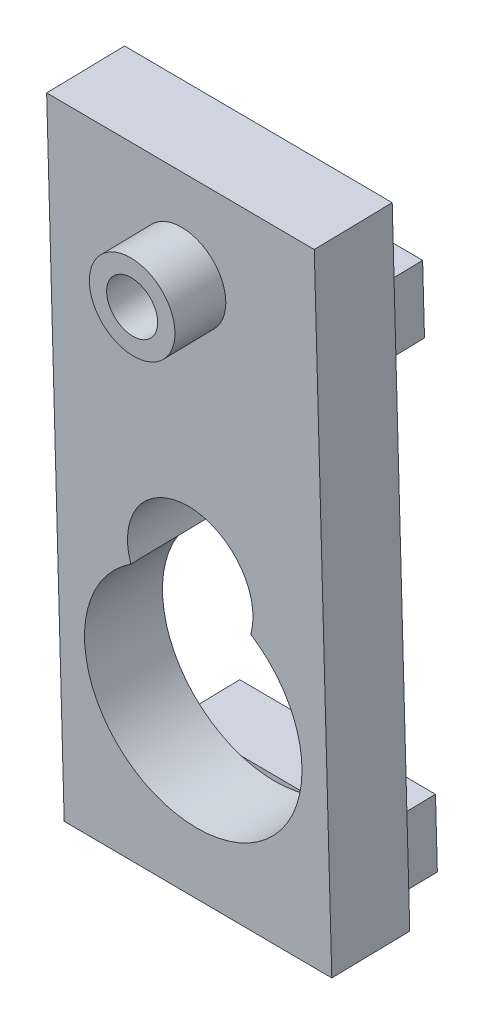
ISO-10303-21;
HEADER;
FILE_DESCRIPTION(('STEP AP214'),'2;1');
FILE_NAME('part.step','',(''),(''),'','','');
FILE_SCHEMA(('AUTOMOTIVE_DESIGN { 1 0 10303 214 1 1 1 1 }'));
ENDSEC;
DATA;
#1=APPLICATION_CONTEXT('core data for automotive mechanical design processes');
#2=APPLICATION_PROTOCOL_DEFINITION('international standard','automotive_design',2000,#1);
#3=PRODUCT_CONTEXT('',#1,'mechanical');
#4=PRODUCT('Part','Part','',(#3));
#5=PRODUCT_RELATED_PRODUCT_CATEGORY('part','',(#4));
#6=PRODUCT_DEFINITION_FORMATION('','',#4);
#7=PRODUCT_DEFINITION_CONTEXT('part definition',#1,'design');
#8=PRODUCT_DEFINITION('design','',#6,#7);
#9=PRODUCT_DEFINITION_SHAPE('','',#8);
#10=(LENGTH_UNIT() NAMED_UNIT(*) SI_UNIT(.MILLI.,.METRE.));
#11=(NAMED_UNIT(*) PLANE_ANGLE_UNIT() SI_UNIT($,.RADIAN.));
#12=(NAMED_UNIT(*) SI_UNIT($,.STERADIAN.) SOLID_ANGLE_UNIT());
#13=UNCERTAINTY_MEASURE_WITH_UNIT(LENGTH_MEASURE(1.E-05),#10,'distance_accuracy_value','');
#14=(GEOMETRIC_REPRESENTATION_CONTEXT(3) GLOBAL_UNCERTAINTY_ASSIGNED_CONTEXT((#13)) GLOBAL_UNIT_ASSIGNED_CONTEXT((#10,
#11,#12)) REPRESENTATION_CONTEXT('',''));
#15=CARTESIAN_POINT('',(0.,0.,0.));
#16=DIRECTION('',(0.,0.,1.));
#17=DIRECTION('',(1.,0.,0.));
#18=AXIS2_PLACEMENT_3D('',#15,#16,#17);
#19=CARTESIAN_POINT('',(-20.884405057928,27.3763798655828,114.124003890815));
#20=DIRECTION('',(0.999977156525081,-0.000185295208077119,0.00675663331104303));
#21=DIRECTION('',(0.00675663342703565,0.,-0.999977173691849));
#22=AXIS2_PLACEMENT_3D('',#19,#20,#21);
#23=PLANE('',#22);
#24=DIRECTION('',(0.,-0.999624168830984,-0.0274138849684033));
#25=VECTOR('',#24,1.);
#26=CARTESIAN_POINT('',(-20.8533128592784,27.5024808557868,109.525837754687));
#27=LINE('',#26,#25);
#28=CARTESIAN_POINT('',(-20.8533128592784,27.5024808557868,109.525837754687));
#29=VERTEX_POINT('',#28);
#30=CARTESIAN_POINT('',(-20.8533128592784,-10.4832375597902,108.484110125888));
#31=VERTEX_POINT('',#30);
#32=EDGE_CURVE('E243',#29,#31,#27,.T.);
#33=ORIENTED_EDGE('',*,*,#32,.T.);
#34=DIRECTION('',(0.00675917361916643,0.027413258740009,-0.999601333941306));
#35=VECTOR('',#34,1.);
#36=CARTESIAN_POINT('',(-20.8844050579265,-10.6093385499943,113.082276262018));
#37=LINE('',#36,#35);
#38=CARTESIAN_POINT('',(-20.8844050579265,-10.6093385499943,113.082276262018));
#39=VERTEX_POINT('',#38);
#40=EDGE_CURVE('E48',#39,#31,#37,.T.);
#41=ORIENTED_EDGE('',*,*,#40,.F.);
#42=DIRECTION('',(0.,-0.999624168830984,-0.0274138849684033));
#43=VECTOR('',#42,1.);
#44=CARTESIAN_POINT('',(-20.884405057928,27.3763798655828,114.124003890815));
#45=LINE('',#44,#43);
#46=CARTESIAN_POINT('',(-20.884405057928,27.3763798655828,114.124003890815));
#47=VERTEX_POINT('',#46);
#48=EDGE_CURVE('E242',#47,#39,#45,.T.);
#49=ORIENTED_EDGE('',*,*,#48,.F.);
#50=DIRECTION('',(0.00675917361916643,0.027413258740009,-0.999601333941306));
#51=VECTOR('',#50,1.);
#52=CARTESIAN_POINT('',(-20.884405057928,27.3763798655828,114.124003890815));
#53=LINE('',#52,#51);
#54=EDGE_CURVE('E251',#47,#29,#53,.T.);
#55=ORIENTED_EDGE('',*,*,#54,.T.);
#56=EDGE_LOOP('',(#33,#41,#49,#55));
#57=FACE_BOUND('',#56,.T.);
#58=ADVANCED_FACE('F41',(#57),#23,.F.);
#59=CARTESIAN_POINT('',(-20.8844050579265,-10.6093385499943,113.082276262018));
#60=DIRECTION('',(0.,0.999624168830984,0.0274138849684036));
#61=DIRECTION('',(0.,-0.0274138849684042,0.999624168830939));
#62=AXIS2_PLACEMENT_3D('',#59,#60,#61);
#63=PLANE('',#62);
#64=DIRECTION('',(0.999977156525081,-0.000185295208073576,0.00675663331104347));
#65=VECTOR('',#64,1.);
#66=CARTESIAN_POINT('',(-20.8533128592784,-10.4832375597902,108.484110125888));
#67=LINE('',#66,#65);
#68=CARTESIAN_POINT('',(-18.7033619727555,-10.4836359444876,108.498636887507));
#69=VERTEX_POINT('',#68);
#70=EDGE_CURVE('E257',#31,#69,#67,.T.);
#71=ORIENTED_EDGE('',*,*,#70,.T.);
#72=DIRECTION('',(-0.00675917361916676,-0.0274132587400088,0.999601333941306));
#73=VECTOR('',#72,1.);
#74=CARTESIAN_POINT('',(-18.5943192491483,-10.0413901072972,92.3725158386143));
#75=LINE('',#74,#73);
#76=CARTESIAN_POINT('',(-18.6780150716776,-10.3808362242126,104.750131885227));
#77=VERTEX_POINT('',#76);
#78=EDGE_CURVE('E185',#77,#69,#75,.T.);
#79=ORIENTED_EDGE('',*,*,#78,.F.);
#80=DIRECTION('',(0.999977156525081,-0.000185295208073633,0.00675663331104331));
#81=VECTOR('',#80,1.);
#82=CARTESIAN_POINT('',(-18.6780150716776,-10.3808362242126,104.750131885227));
#83=LINE('',#82,#81);
#84=CARTESIAN_POINT('',(-6.97828234033482,-10.3830041781474,104.829184494959));
#85=VERTEX_POINT('',#84);
#86=EDGE_CURVE('E175',#77,#85,#83,.T.);
#87=ORIENTED_EDGE('',*,*,#86,.T.);
#88=DIRECTION('',(-0.00675917361916676,-0.0274132587400088,0.999601333941306));
#89=VECTOR('',#88,1.);
#90=CARTESIAN_POINT('',(-6.89458651780117,-10.0435580612318,92.4515684483473));
#91=LINE('',#90,#89);
#92=CARTESIAN_POINT('',(-7.00362924140871,-10.485803898422,108.57768949724));
#93=VERTEX_POINT('',#92);
#94=EDGE_CURVE('E174',#85,#93,#91,.T.);
#95=ORIENTED_EDGE('',*,*,#94,.T.);
#96=CARTESIAN_POINT('',(-4.8536783548771,-10.4862022831194,108.592216258865));
#97=VERTEX_POINT('',#96);
#98=EDGE_CURVE('E171',#93,#97,#67,.T.);
#99=ORIENTED_EDGE('',*,*,#98,.T.);
#100=DIRECTION('',(0.00675917361916643,0.027413258740009,-0.999601333941306));
#101=VECTOR('',#100,1.);
#102=CARTESIAN_POINT('',(-4.88477055352496,-10.612303273324,113.19038239499));
#103=LINE('',#102,#101);
#104=CARTESIAN_POINT('',(-4.88477055352496,-10.612303273324,113.19038239499));
#105=VERTEX_POINT('',#104);
#106=EDGE_CURVE('E270',#105,#97,#103,.T.);
#107=ORIENTED_EDGE('',*,*,#106,.F.);
#108=DIRECTION('',(0.999977156525081,-0.000185295208073576,0.00675663331104347));
#109=VECTOR('',#108,1.);
#110=CARTESIAN_POINT('',(-20.8844050579265,-10.6093385499943,113.082276262018));
#111=LINE('',#110,#109);
#112=EDGE_CURVE('E250',#39,#105,#111,.T.);
#113=ORIENTED_EDGE('',*,*,#112,.F.);
#114=ORIENTED_EDGE('',*,*,#40,.T.);
#115=EDGE_LOOP('',(#71,#79,#87,#95,#99,#107,#113,#114));
#116=FACE_BOUND('',#115,.T.);
#117=ADVANCED_FACE('F271',(#116),#63,.F.);
#118=CARTESIAN_POINT('',(-4.88477055352496,-10.612303273324,113.19038239499));
#119=DIRECTION('',(-0.999977156525081,0.000185295208073359,-0.0067566333110433));
#120=DIRECTION('',(-0.00675663342703575,0.,0.999977173691849));
#121=AXIS2_PLACEMENT_3D('',#118,#119,#120);
#122=PLANE('',#121);
#123=DIRECTION('',(0.,0.999624168830984,0.0274138849684034));
#124=VECTOR('',#123,1.);
#125=CARTESIAN_POINT('',(-4.8536783548771,-10.4862022831194,108.592216258865));
#126=LINE('',#125,#124);
#127=CARTESIAN_POINT('',(-4.85367835487727,27.4995161324565,109.633943887664));
#128=VERTEX_POINT('',#127);
#129=EDGE_CURVE('E260',#97,#128,#126,.T.);
#130=ORIENTED_EDGE('',*,*,#129,.T.);
#131=DIRECTION('',(0.00675917361916643,0.027413258740009,-0.999601333941306));
#132=VECTOR('',#131,1.);
#133=CARTESIAN_POINT('',(-4.88477055352543,27.3734151422536,114.232110023792));
#134=LINE('',#133,#132);
#135=CARTESIAN_POINT('',(-4.88477055352543,27.3734151422536,114.232110023792));
#136=VERTEX_POINT('',#135);
#137=EDGE_CURVE('E264',#136,#128,#134,.T.);
#138=ORIENTED_EDGE('',*,*,#137,.F.);
#139=DIRECTION('',(0.,0.999624168830984,0.0274138849684034));
#140=VECTOR('',#139,1.);
#141=CARTESIAN_POINT('',(-4.88477055352496,-10.612303273324,113.19038239499));
#142=LINE('',#141,#140);
#143=EDGE_CURVE('E249',#105,#136,#142,.T.);
#144=ORIENTED_EDGE('',*,*,#143,.F.);
#145=ORIENTED_EDGE('',*,*,#106,.T.);
#146=EDGE_LOOP('',(#130,#138,#144,#145));
#147=FACE_BOUND('',#146,.T.);
#148=ADVANCED_FACE('F347',(#147),#122,.F.);
#149=CARTESIAN_POINT('',(-4.88477055352543,27.3734151422536,114.232110023792));
#150=DIRECTION('',(0.,-0.999624168830984,-0.0274138849684036));
#151=DIRECTION('',(0.,0.0274138849684035,-0.999624168830936));
#152=AXIS2_PLACEMENT_3D('',#149,#150,#151);
#153=PLANE('',#152);
#154=DIRECTION('',(-0.999977156525081,0.000185295208077046,-0.00675663331104355));
#155=VECTOR('',#154,1.);
#156=CARTESIAN_POINT('',(-4.85367835487727,27.4995161324565,109.633943887664));
#157=LINE('',#156,#155);
#158=EDGE_CURVE('E247',#128,#29,#157,.T.);
#159=ORIENTED_EDGE('',*,*,#158,.T.);
#160=ORIENTED_EDGE('',*,*,#54,.F.);
#161=DIRECTION('',(-0.999977156525081,0.000185295208077046,-0.00675663331104355));
#162=VECTOR('',#161,1.);
#163=CARTESIAN_POINT('',(-4.88477055352543,27.3734151422536,114.232110023792));
#164=LINE('',#163,#162);
#165=EDGE_CURVE('E255',#136,#47,#164,.T.);
#166=ORIENTED_EDGE('',*,*,#165,.F.);
#167=ORIENTED_EDGE('',*,*,#137,.T.);
#168=EDGE_LOOP('',(#159,#160,#166,#167));
#169=FACE_BOUND('',#168,.T.);
#170=ADVANCED_FACE('F352',(#169),#153,.F.);
#171=CARTESIAN_POINT('',(-0.766957969553894,-3.11056032093504,113.4239557435));
#172=DIRECTION('',(-0.00675917361916677,-0.0274132587400088,0.999601333941306));
#173=DIRECTION('',(0.,-0.999624168830984,-0.0274138849684033));
#174=AXIS2_PLACEMENT_3D('',#171,#172,#173);
#175=PLANE('',#174);
#176=CARTESIAN_POINT('',(-12.8845878057327,21.8869608170352,114.02755472882));
#177=DIRECTION('',(-0.00675917361916677,-0.0274132587400088,0.999601333941306));
#178=DIRECTION('',(0.,-0.999624168830984,-0.0274138849684032));
#179=AXIS2_PLACEMENT_3D('',#176,#177,#178);
#180=CIRCLE('',#179,2.56);
#181=CARTESIAN_POINT('',(-12.8845878057329,24.4459986892435,114.097734274339));
#182=VERTEX_POINT('',#181);
#183=EDGE_CURVE('E297',#182,#182,#180,.T.);
#184=ORIENTED_EDGE('',*,*,#183,.F.);
#185=EDGE_LOOP('',(#184));
#186=FACE_BOUND('',#185,.T.);
#187=CARTESIAN_POINT('',(-12.8845878057286,-0.364673181141409,113.417321649423));
#188=DIRECTION('',(-0.00675917361916677,-0.0274132587400088,0.999601333941306));
#189=DIRECTION('',(0.,-0.999624168830984,-0.0274138849684033));
#190=AXIS2_PLACEMENT_3D('',#187,#188,#189);
#191=CIRCLE('',#190,6.50000000000001);
#192=CARTESIAN_POINT('',(-9.29913527495973,5.05424292160044,113.590175405726));
#193=VERTEX_POINT('',#192);
#194=CARTESIAN_POINT('',(-16.4700403364921,5.05557168629963,113.541723122904));
#195=VERTEX_POINT('',#194);
#196=EDGE_CURVE('E222',#193,#195,#191,.F.);
#197=ORIENTED_EDGE('',*,*,#196,.T.);
#198=CARTESIAN_POINT('',(-12.884587805726,6.15287639963634,113.596060179426));
#199=DIRECTION('',(-0.00675917361916677,-0.0274132587400088,0.999601333941306));
#200=DIRECTION('',(0.,-0.999624168830984,-0.0274138849684033));
#201=AXIS2_PLACEMENT_3D('',#198,#199,#200);
#202=CIRCLE('',#201,3.74999999999999);
#203=EDGE_CURVE('E238',#195,#193,#202,.F.);
#204=ORIENTED_EDGE('',*,*,#203,.T.);
#205=EDGE_LOOP('',(#197,#204));
#206=FACE_BOUND('',#205,.T.);
#207=ORIENTED_EDGE('',*,*,#48,.T.);
#208=ORIENTED_EDGE('',*,*,#112,.T.);
#209=ORIENTED_EDGE('',*,*,#143,.T.);
#210=ORIENTED_EDGE('',*,*,#165,.T.);
#211=EDGE_LOOP('',(#207,#208,#209,#210));
#212=FACE_BOUND('',#211,.T.);
#213=ADVANCED_FACE('F326',(#186,#206,#212),#175,.T.);
#214=CARTESIAN_POINT('',(-0.73586577090573,-2.98445933073099,108.825789607372));
#215=DIRECTION('',(-0.00675917361916677,-0.0274132587400088,0.999601333941306));
#216=DIRECTION('',(0.,-0.999624168830984,-0.0274138849684033));
#217=AXIS2_PLACEMENT_3D('',#214,#215,#216);
#218=PLANE('',#217);
#219=DIRECTION('',(0.,0.999624168830984,0.0274138849684017));
#220=VECTOR('',#219,1.);
#221=CARTESIAN_POINT('',(-18.7033619727495,-6.43515806072227,108.609663121629));
#222=LINE('',#221,#220);
#223=CARTESIAN_POINT('',(-18.7033619727495,-6.43515806072227,108.609663121629));
#224=VERTEX_POINT('',#223);
#225=EDGE_CURVE('E179',#69,#224,#222,.T.);
#226=ORIENTED_EDGE('',*,*,#225,.F.);
#227=ORIENTED_EDGE('',*,*,#70,.F.);
#228=ORIENTED_EDGE('',*,*,#32,.F.);
#229=ORIENTED_EDGE('',*,*,#158,.F.);
#230=ORIENTED_EDGE('',*,*,#129,.F.);
#231=ORIENTED_EDGE('',*,*,#98,.F.);
#232=DIRECTION('',(0.,-0.999624168830984,-0.0274138849684057));
#233=VECTOR('',#232,1.);
#234=CARTESIAN_POINT('',(-7.00362924140871,-10.485803898422,108.57768949724));
#235=LINE('',#234,#233);
#236=CARTESIAN_POINT('',(-7.00362924140996,-6.43732601465659,108.688715731363));
#237=VERTEX_POINT('',#236);
#238=EDGE_CURVE('E165',#237,#93,#235,.T.);
#239=ORIENTED_EDGE('',*,*,#238,.F.);
#240=DIRECTION('',(0.999977156525081,-0.00018529520807268,0.00675663331104294));
#241=VECTOR('',#240,1.);
#242=CARTESIAN_POINT('',(-8.00360639793113,-6.43714071944865,108.681959098057));
#243=LINE('',#242,#241);
#244=CARTESIAN_POINT('',(-10.9016180661676,-6.43660371950664,108.66237784858));
#245=VERTEX_POINT('',#244);
#246=EDGE_CURVE('E147',#245,#237,#243,.T.);
#247=ORIENTED_EDGE('',*,*,#246,.F.);
#248=CARTESIAN_POINT('',(-12.8534956070803,-0.238572190937533,108.819155513301));
#249=DIRECTION('',(0.00675917361916677,0.0274132587400091,-0.999601333941306));
#250=DIRECTION('',(0.,0.999624168830984,0.0274138849684037));
#251=AXIS2_PLACEMENT_3D('',#248,#249,#250);
#252=CIRCLE('',#251,6.50000000000001);
#253=CARTESIAN_POINT('',(-9.2680430763116,5.18034391180463,108.992009269602));
#254=VERTEX_POINT('',#253);
#255=EDGE_CURVE('E230',#254,#245,#252,.T.);
#256=ORIENTED_EDGE('',*,*,#255,.F.);
#257=CARTESIAN_POINT('',(-12.8534956070838,6.27897738984057,108.997894043296));
#258=DIRECTION('',(0.00675917361916677,0.0274132587400091,-0.999601333941306));
#259=DIRECTION('',(0.,0.999624168830984,0.0274138849684037));
#260=AXIS2_PLACEMENT_3D('',#257,#258,#259);
#261=CIRCLE('',#260,3.74999999999999);
#262=CARTESIAN_POINT('',(-16.4389481378439,5.1816726765038,108.943556986775));
#263=VERTEX_POINT('',#262);
#264=EDGE_CURVE('E233',#263,#254,#261,.T.);
#265=ORIENTED_EDGE('',*,*,#264,.F.);
#266=CARTESIAN_POINT('',(-14.8053731479939,-6.43588035587235,108.636001004417));
#267=VERTEX_POINT('',#266);
#268=EDGE_CURVE('E226',#267,#263,#252,.T.);
#269=ORIENTED_EDGE('',*,*,#268,.F.);
#270=EDGE_CURVE('E54',#224,#267,#243,.T.);
#271=ORIENTED_EDGE('',*,*,#270,.F.);
#272=EDGE_LOOP('',(#226,#227,#228,#229,#230,#231,#239,#247,#256,#265,#269,#271));
#273=FACE_BOUND('',#272,.T.);
#274=DIRECTION('',(-0.999977156525081,0.000185295208072137,-0.00675663331104389));
#275=VECTOR('',#274,1.);
#276=CARTESIAN_POINT('',(-18.7033619727495,17.3558971574542,109.262113583876));
#277=LINE('',#276,#275);
#278=CARTESIAN_POINT('',(-7.00362924141215,17.3537292035197,109.341166193616));
#279=VERTEX_POINT('',#278);
#280=CARTESIAN_POINT('',(-18.7033619727495,17.3558971574542,109.262113583876));
#281=VERTEX_POINT('',#280);
#282=EDGE_CURVE('E64',#279,#281,#277,.T.);
#283=ORIENTED_EDGE('',*,*,#282,.F.);
#284=DIRECTION('',(0.,-0.999624168830984,-0.0274138849684019));
#285=VECTOR('',#284,1.);
#286=CARTESIAN_POINT('',(-7.00362924141215,17.3537292035197,109.341166193616));
#287=LINE('',#286,#285);
#288=CARTESIAN_POINT('',(-7.0036292414061,21.4022070872864,109.452192427738));
#289=VERTEX_POINT('',#288);
#290=EDGE_CURVE('E187',#289,#279,#287,.T.);
#291=ORIENTED_EDGE('',*,*,#290,.F.);
#292=DIRECTION('',(0.999977156525081,-0.000185295208077469,0.00675663331104276));
#293=VECTOR('',#292,1.);
#294=CARTESIAN_POINT('',(-7.0036292414061,21.4022070872864,109.452192427738));
#295=LINE('',#294,#293);
#296=CARTESIAN_POINT('',(-18.7033619727496,21.4043750412209,109.373139817998));
#297=VERTEX_POINT('',#296);
#298=EDGE_CURVE('E191',#297,#289,#295,.T.);
#299=ORIENTED_EDGE('',*,*,#298,.F.);
#300=DIRECTION('',(0.,0.999624168830984,0.0274138849684056));
#301=VECTOR('',#300,1.);
#302=CARTESIAN_POINT('',(-18.7033619727496,21.4043750412209,109.373139817998));
#303=LINE('',#302,#301);
#304=EDGE_CURVE('E198',#281,#297,#303,.T.);
#305=ORIENTED_EDGE('',*,*,#304,.F.);
#306=EDGE_LOOP('',(#283,#291,#299,#305));
#307=FACE_BOUND('',#306,.T.);
#308=ADVANCED_FACE('F169',(#273,#307),#218,.F.);
#309=CARTESIAN_POINT('',(-12.8923641701486,-0.396211872389683,114.567353396527));
#310=DIRECTION('',(0.00675917361916677,0.0274132587400091,-0.999601333941306));
#311=DIRECTION('',(0.,0.999624168830984,0.0274138849684037));
#312=AXIS2_PLACEMENT_3D('',#309,#310,#311);
#313=CYLINDRICAL_SURFACE('',#312,6.50000000000001);
#314=DIRECTION('',(0.00675917361916677,0.0274132587400091,-0.999601333941306));
#315=VECTOR('',#314,1.);
#316=CARTESIAN_POINT('',(-9.30691163937852,5.02270423035225,114.740207152831));
#317=LINE('',#316,#315);
#318=EDGE_CURVE('E236',#193,#254,#317,.T.);
#319=ORIENTED_EDGE('',*,*,#318,.T.);
#320=ORIENTED_EDGE('',*,*,#255,.T.);
#321=EDGE_CURVE('E235',#245,#267,#252,.T.);
#322=ORIENTED_EDGE('',*,*,#321,.T.);
#323=ORIENTED_EDGE('',*,*,#268,.T.);
#324=DIRECTION('',(0.00675917361916677,0.0274132587400091,-0.999601333941306));
#325=VECTOR('',#324,1.);
#326=CARTESIAN_POINT('',(-16.4778167009109,5.02403299505144,114.691754870004));
#327=LINE('',#326,#325);
#328=EDGE_CURVE('E232',#195,#263,#327,.T.);
#329=ORIENTED_EDGE('',*,*,#328,.F.);
#330=ORIENTED_EDGE('',*,*,#196,.F.);
#331=EDGE_LOOP('',(#319,#320,#322,#323,#329,#330));
#332=FACE_BOUND('',#331,.T.);
#333=ADVANCED_FACE('F361',(#332),#313,.F.);
#334=CARTESIAN_POINT('',(-12.8923641701507,6.12133770838819,114.746091926524));
#335=DIRECTION('',(0.00675917361916677,0.0274132587400091,-0.999601333941306));
#336=DIRECTION('',(0.,0.999624168830984,0.0274138849684037));
#337=AXIS2_PLACEMENT_3D('',#334,#335,#336);
#338=CYLINDRICAL_SURFACE('',#337,3.74999999999999);
#339=ORIENTED_EDGE('',*,*,#328,.T.);
#340=ORIENTED_EDGE('',*,*,#264,.T.);
#341=ORIENTED_EDGE('',*,*,#318,.F.);
#342=ORIENTED_EDGE('',*,*,#203,.F.);
#343=EDGE_LOOP('',(#339,#340,#341,#342));
#344=FACE_BOUND('',#343,.T.);
#345=ADVANCED_FACE('F371',(#344),#338,.F.);
#346=CARTESIAN_POINT('',(-18.5943192491443,17.7981429946452,93.1359925349812));
#347=DIRECTION('',(0.,0.999624168830965,0.0274138849684023));
#348=DIRECTION('',(0.,-0.027413884968404,0.999624168830936));
#349=AXIS2_PLACEMENT_3D('',#346,#347,#348);
#350=PLANE('',#349);
#351=DIRECTION('',(-0.00675917361916676,-0.0274132587400088,0.999601333941306));
#352=VECTOR('',#351,1.);
#353=CARTESIAN_POINT('',(-18.5943192491443,17.7981429946452,93.1359925349812));
#354=LINE('',#353,#352);
#355=CARTESIAN_POINT('',(-18.6780150716782,17.4586968777292,105.513608581591));
#356=VERTEX_POINT('',#355);
#357=EDGE_CURVE('E199',#356,#281,#354,.T.);
#358=ORIENTED_EDGE('',*,*,#357,.F.);
#359=DIRECTION('',(0.999977156525081,-0.000185295208072119,0.00675663331104335));
#360=VECTOR('',#359,1.);
#361=CARTESIAN_POINT('',(-18.6780150716782,17.4586968777292,105.513608581591));
#362=LINE('',#361,#360);
#363=CARTESIAN_POINT('',(-6.97828234033882,17.4565289237955,105.592661191333));
#364=VERTEX_POINT('',#363);
#365=EDGE_CURVE('E210',#356,#364,#362,.T.);
#366=ORIENTED_EDGE('',*,*,#365,.T.);
#367=DIRECTION('',(-0.00675917361916676,-0.0274132587400088,0.999601333941306));
#368=VECTOR('',#367,1.);
#369=CARTESIAN_POINT('',(-6.89458651780425,17.7959750407118,93.2150451447217));
#370=LINE('',#369,#368);
#371=EDGE_CURVE('E205',#364,#279,#370,.T.);
#372=ORIENTED_EDGE('',*,*,#371,.T.);
#373=ORIENTED_EDGE('',*,*,#282,.T.);
#374=EDGE_LOOP('',(#358,#366,#372,#373));
#375=FACE_BOUND('',#374,.T.);
#376=ADVANCED_FACE('F374',(#375),#350,.F.);
#377=CARTESIAN_POINT('',(-18.5943192491467,21.8466208784113,93.2470187691029));
#378=DIRECTION('',(0.999977156525081,-0.000185295208077413,0.00675663331104334));
#379=DIRECTION('',(0.00675663342703578,0.,-0.999977173691849));
#380=AXIS2_PLACEMENT_3D('',#377,#378,#379);
#381=PLANE('',#380);
#382=DIRECTION('',(-0.00675917361916676,-0.0274132587400088,0.999601333941306));
#383=VECTOR('',#382,1.);
#384=CARTESIAN_POINT('',(-18.5943192491467,21.8466208784113,93.2470187691029));
#385=LINE('',#384,#383);
#386=CARTESIAN_POINT('',(-18.6780150716777,21.5071747614958,105.624634815719));
#387=VERTEX_POINT('',#386);
#388=EDGE_CURVE('E195',#387,#297,#385,.T.);
#389=ORIENTED_EDGE('',*,*,#388,.F.);
#390=DIRECTION('',(0.,-0.999624168830984,-0.0274138849684038));
#391=VECTOR('',#390,1.);
#392=CARTESIAN_POINT('',(-18.6780150716777,21.5071747614958,105.624634815719));
#393=LINE('',#392,#391);
#394=EDGE_CURVE('E201',#387,#356,#393,.T.);
#395=ORIENTED_EDGE('',*,*,#394,.T.);
#396=ORIENTED_EDGE('',*,*,#357,.T.);
#397=ORIENTED_EDGE('',*,*,#304,.T.);
#398=EDGE_LOOP('',(#389,#395,#396,#397));
#399=FACE_BOUND('',#398,.T.);
#400=ADVANCED_FACE('F387',(#399),#381,.F.);
#401=CARTESIAN_POINT('',(-6.89458651779973,21.8444529244771,93.3260713788454));
#402=DIRECTION('',(0.,-0.999624168830984,-0.0274138849684032));
#403=DIRECTION('',(0.,0.027413884968404,-0.999624168830937));
#404=AXIS2_PLACEMENT_3D('',#401,#402,#403);
#405=PLANE('',#404);
#406=DIRECTION('',(-0.00675917361916676,-0.0274132587400088,0.999601333941306));
#407=VECTOR('',#406,1.);
#408=CARTESIAN_POINT('',(-6.89458651779973,21.8444529244771,93.3260713788454));
#409=LINE('',#408,#407);
#410=CARTESIAN_POINT('',(-6.97828234033199,21.5050068075603,105.703687425453));
#411=VERTEX_POINT('',#410);
#412=EDGE_CURVE('E188',#411,#289,#409,.T.);
#413=ORIENTED_EDGE('',*,*,#412,.F.);
#414=DIRECTION('',(-0.999977156525081,0.000185295208077483,-0.00675663331104319));
#415=VECTOR('',#414,1.);
#416=CARTESIAN_POINT('',(-6.97828234033199,21.5050068075603,105.703687425453));
#417=LINE('',#416,#415);
#418=EDGE_CURVE('E197',#411,#387,#417,.T.);
#419=ORIENTED_EDGE('',*,*,#418,.T.);
#420=ORIENTED_EDGE('',*,*,#388,.T.);
#421=ORIENTED_EDGE('',*,*,#298,.T.);
#422=EDGE_LOOP('',(#413,#419,#420,#421));
#423=FACE_BOUND('',#422,.T.);
#424=ADVANCED_FACE('F393',(#423),#405,.F.);
#425=CARTESIAN_POINT('',(-6.89458651780425,17.7959750407118,93.2150451447217));
#426=DIRECTION('',(-0.999977156525081,0.000185295208077397,-0.00675663331104335));
#427=DIRECTION('',(-0.00675663342703578,0.,0.999977173691849));
#428=AXIS2_PLACEMENT_3D('',#425,#426,#427);
#429=PLANE('',#428);
#430=ORIENTED_EDGE('',*,*,#371,.F.);
#431=DIRECTION('',(0.,0.999624168830984,0.0274138849684038));
#432=VECTOR('',#431,1.);
#433=CARTESIAN_POINT('',(-6.97828234033882,17.4565289237955,105.592661191333));
#434=LINE('',#433,#432);
#435=EDGE_CURVE('E193',#364,#411,#434,.T.);
#436=ORIENTED_EDGE('',*,*,#435,.T.);
#437=ORIENTED_EDGE('',*,*,#412,.T.);
#438=ORIENTED_EDGE('',*,*,#290,.T.);
#439=EDGE_LOOP('',(#430,#436,#437,#438));
#440=FACE_BOUND('',#439,.T.);
#441=ADVANCED_FACE('F381',(#440),#429,.F.);
#442=CARTESIAN_POINT('',(-12.7444528834719,19.396457687807,93.2193810558085));
#443=DIRECTION('',(-0.00675917361916676,-0.0274132587400088,0.999601333941306));
#444=DIRECTION('',(0.,-0.999624168830984,-0.0274138849684032));
#445=AXIS2_PLACEMENT_3D('',#442,#443,#444);
#446=CYLINDRICAL_SURFACE('',#445,0.99999999999997);
#447=CARTESIAN_POINT('',(-12.8281487060059,19.0570115708913,105.596997102416));
#448=DIRECTION('',(-0.00675917361916663,-0.0274132587400093,0.999601333941306));
#449=DIRECTION('',(0.,-0.999624168830984,-0.0274138849684038));
#450=AXIS2_PLACEMENT_3D('',#447,#448,#449);
#451=CIRCLE('',#450,0.99999999999997);
#452=CARTESIAN_POINT('',(-12.8281487060059,18.0573874020604,105.569583217447));
#453=VERTEX_POINT('',#452);
#454=EDGE_CURVE('E186',#453,#453,#451,.T.);
#455=ORIENTED_EDGE('',*,*,#454,.F.);
#456=EDGE_LOOP('',(#455));
#457=FACE_BOUND('',#456,.T.);
#458=CARTESIAN_POINT('',(-12.8534956070778,18.9542118506177,109.345502104695));
#459=DIRECTION('',(0.00675917361916676,0.0274132587400088,-0.999601333941306));
#460=DIRECTION('',(0.,0.999624168830984,0.0274138849684032));
#461=AXIS2_PLACEMENT_3D('',#458,#459,#460);
#462=CIRCLE('',#461,0.99999999999997);
#463=CARTESIAN_POINT('',(-12.8534956070778,19.9538360194487,109.372915989664));
#464=VERTEX_POINT('',#463);
#465=EDGE_CURVE('E203',#464,#464,#462,.T.);
#466=ORIENTED_EDGE('',*,*,#465,.F.);
#467=EDGE_LOOP('',(#466));
#468=FACE_BOUND('',#467,.T.);
#469=ADVANCED_FACE('F379',(#457,#468),#446,.F.);
#470=CARTESIAN_POINT('',(-18.6780150716777,21.5071747614957,105.624634815719));
#471=DIRECTION('',(-0.00675917361916663,-0.0274132587400093,0.999601333941306));
#472=DIRECTION('',(0.,0.999624168830984,0.0274138849684038));
#473=AXIS2_PLACEMENT_3D('',#470,#471,#472);
#474=PLANE('',#473);
#475=ORIENTED_EDGE('',*,*,#454,.T.);
#476=EDGE_LOOP('',(#475));
#477=FACE_BOUND('',#476,.T.);
#478=ORIENTED_EDGE('',*,*,#394,.F.);
#479=ORIENTED_EDGE('',*,*,#418,.F.);
#480=ORIENTED_EDGE('',*,*,#435,.F.);
#481=ORIENTED_EDGE('',*,*,#365,.F.);
#482=EDGE_LOOP('',(#478,#479,#480,#481));
#483=FACE_BOUND('',#482,.T.);
#484=ADVANCED_FACE('F380',(#477,#483),#474,.F.);
#485=ORIENTED_EDGE('',*,*,#465,.T.);
#486=EDGE_LOOP('',(#485));
#487=FACE_BOUND('',#486,.T.);
#488=ADVANCED_FACE('F362',(#487),#218,.F.);
#489=CARTESIAN_POINT('',(-0.735865770906785,-2.98445933073126,108.825789607372));
#490=DIRECTION('',(-0.00675917361917641,-0.0274132587400081,0.999601333941282));
#491=DIRECTION('',(0.,-0.999624168830984,-0.0274138849684017));
#492=AXIS2_PLACEMENT_3D('',#489,#490,#491);
#493=PLANE('',#492);
#494=ORIENTED_EDGE('',*,*,#321,.F.);
#495=EDGE_CURVE('E155',#267,#245,#243,.T.);
#496=ORIENTED_EDGE('',*,*,#495,.F.);
#497=EDGE_LOOP('',(#494,#496));
#498=FACE_BOUND('',#497,.T.);
#499=ADVANCED_FACE('F398',(#498),#493,.T.);
#500=CARTESIAN_POINT('',(-6.89458651780117,-10.0435580612318,92.4515684483473));
#501=DIRECTION('',(-0.999977156525081,0.000185295208079131,-0.0067566333110433));
#502=DIRECTION('',(-0.00675663342703573,0.,0.999977173691849));
#503=AXIS2_PLACEMENT_3D('',#500,#501,#502);
#504=PLANE('',#503);
#505=ORIENTED_EDGE('',*,*,#94,.F.);
#506=DIRECTION('',(0.,0.999624168830984,0.0274138849684038));
#507=VECTOR('',#506,1.);
#508=CARTESIAN_POINT('',(-6.97828234033482,-10.3830041781474,104.829184494959));
#509=LINE('',#508,#507);
#510=CARTESIAN_POINT('',(-6.97828234033712,-6.33452629438152,104.940210729083));
#511=VERTEX_POINT('',#510);
#512=EDGE_CURVE('E168',#85,#511,#509,.T.);
#513=ORIENTED_EDGE('',*,*,#512,.T.);
#514=DIRECTION('',(-0.00675917361916676,-0.0274132587400088,0.999601333941306));
#515=VECTOR('',#514,1.);
#516=CARTESIAN_POINT('',(-6.89458651780236,-5.99508017746563,92.5625946824687));
#517=LINE('',#516,#515);
#518=EDGE_CURVE('E153',#511,#237,#517,.T.);
#519=ORIENTED_EDGE('',*,*,#518,.T.);
#520=ORIENTED_EDGE('',*,*,#238,.T.);
#521=EDGE_LOOP('',(#505,#513,#519,#520));
#522=FACE_BOUND('',#521,.T.);
#523=ADVANCED_FACE('F161',(#522),#504,.F.);
#524=CARTESIAN_POINT('',(-18.5943192491433,-5.99291222353137,92.4835420727355));
#525=DIRECTION('',(0.999977156525081,-0.000185295208077392,0.00675663331104335));
#526=DIRECTION('',(0.00675663342703578,0.,-0.999977173691849));
#527=AXIS2_PLACEMENT_3D('',#524,#525,#526);
#528=PLANE('',#527);
#529=DIRECTION('',(-0.00675917361916676,-0.0274132587400088,0.999601333941306));
#530=VECTOR('',#529,1.);
#531=CARTESIAN_POINT('',(-18.5943192491433,-5.99291222353137,92.4835420727355));
#532=LINE('',#531,#530);
#533=CARTESIAN_POINT('',(-18.6780150716769,-6.33235834044708,104.861158119343));
#534=VERTEX_POINT('',#533);
#535=EDGE_CURVE('E184',#534,#224,#532,.T.);
#536=ORIENTED_EDGE('',*,*,#535,.F.);
#537=DIRECTION('',(0.,-0.999624168830984,-0.0274138849684038));
#538=VECTOR('',#537,1.);
#539=CARTESIAN_POINT('',(-18.6780150716769,-6.33235834044709,104.861158119343));
#540=LINE('',#539,#538);
#541=EDGE_CURVE('E289',#534,#77,#540,.T.);
#542=ORIENTED_EDGE('',*,*,#541,.T.);
#543=ORIENTED_EDGE('',*,*,#78,.T.);
#544=ORIENTED_EDGE('',*,*,#225,.T.);
#545=EDGE_LOOP('',(#536,#542,#543,#544));
#546=FACE_BOUND('',#545,.T.);
#547=ADVANCED_FACE('F282',(#546),#528,.F.);
#548=CARTESIAN_POINT('',(-7.89456367432648,-5.99489488225792,92.5558380491672));
#549=DIRECTION('',(0.,-0.999624168830964,-0.0274138849684023));
#550=DIRECTION('',(0.,0.027413884968404,-0.999624168830936));
#551=AXIS2_PLACEMENT_3D('',#548,#549,#550);
#552=PLANE('',#551);
#553=ORIENTED_EDGE('',*,*,#518,.F.);
#554=DIRECTION('',(-0.999977156525081,0.000185295208072695,-0.00675663331104332));
#555=VECTOR('',#554,1.);
#556=CARTESIAN_POINT('',(-7.97825949686262,-6.3343409991735,104.933454095772));
#557=LINE('',#556,#555);
#558=EDGE_CURVE('E182',#511,#534,#557,.T.);
#559=ORIENTED_EDGE('',*,*,#558,.T.);
#560=ORIENTED_EDGE('',*,*,#535,.T.);
#561=ORIENTED_EDGE('',*,*,#270,.T.);
#562=ORIENTED_EDGE('',*,*,#495,.T.);
#563=ORIENTED_EDGE('',*,*,#246,.T.);
#564=EDGE_LOOP('',(#553,#559,#560,#561,#562,#563));
#565=FACE_BOUND('',#564,.T.);
#566=ADVANCED_FACE('F148',(#565),#552,.F.);
#567=CARTESIAN_POINT('',(-12.7444528834708,-7.59339487062895,92.4792061616558));
#568=DIRECTION('',(-0.00675917361916676,-0.0274132587400088,0.999601333941306));
#569=DIRECTION('',(0.,-0.999624168830984,-0.0274138849684032));
#570=AXIS2_PLACEMENT_3D('',#567,#568,#569);
#571=CYLINDRICAL_SURFACE('',#570,1.00000000000004);
#572=CARTESIAN_POINT('',(-12.8281487060025,-7.93284098754443,104.856822208265));
#573=DIRECTION('',(-0.00675917361916663,-0.0274132587400093,0.999601333941306));
#574=DIRECTION('',(0.,-0.999624168830984,-0.0274138849684038));
#575=AXIS2_PLACEMENT_3D('',#572,#573,#574);
#576=CIRCLE('',#575,1.00000000000004);
#577=CARTESIAN_POINT('',(-12.8281487060025,-8.93246515637546,104.829408323296));
#578=VERTEX_POINT('',#577);
#579=EDGE_CURVE('E156',#578,#578,#576,.T.);
#580=ORIENTED_EDGE('',*,*,#579,.F.);
#581=EDGE_LOOP('',(#580));
#582=FACE_BOUND('',#581,.T.);
#583=CARTESIAN_POINT('',(-12.8534956070777,-8.03564070781916,108.605327210549));
#584=DIRECTION('',(0.00675917361916676,0.0274132587400088,-0.999601333941306));
#585=DIRECTION('',(0.,0.999624168830984,0.0274138849684032));
#586=AXIS2_PLACEMENT_3D('',#583,#584,#585);
#587=CIRCLE('',#586,1.00000000000004);
#588=CARTESIAN_POINT('',(-12.8534956070777,-7.03601653898813,108.632741095517));
#589=VERTEX_POINT('',#588);
#590=EDGE_CURVE('E177',#589,#589,#587,.T.);
#591=ORIENTED_EDGE('',*,*,#590,.F.);
#592=EDGE_LOOP('',(#591));
#593=FACE_BOUND('',#592,.T.);
#594=ADVANCED_FACE('F403',(#582,#593),#571,.F.);
#595=CARTESIAN_POINT('',(-18.6780150716777,21.5071747614957,105.624634815719));
#596=DIRECTION('',(-0.00675917361916663,-0.0274132587400093,0.999601333941306));
#597=DIRECTION('',(0.,0.999624168830984,0.0274138849684038));
#598=AXIS2_PLACEMENT_3D('',#595,#596,#597);
#599=PLANE('',#598);
#600=ORIENTED_EDGE('',*,*,#579,.T.);
#601=EDGE_LOOP('',(#600));
#602=FACE_BOUND('',#601,.T.);
#603=ORIENTED_EDGE('',*,*,#86,.F.);
#604=ORIENTED_EDGE('',*,*,#541,.F.);
#605=ORIENTED_EDGE('',*,*,#558,.F.);
#606=ORIENTED_EDGE('',*,*,#512,.F.);
#607=EDGE_LOOP('',(#603,#604,#605,#606));
#608=FACE_BOUND('',#607,.T.);
#609=ADVANCED_FACE('F291',(#602,#608),#599,.F.);
#610=ORIENTED_EDGE('',*,*,#590,.T.);
#611=EDGE_LOOP('',(#610));
#612=FACE_BOUND('',#611,.T.);
#613=ADVANCED_FACE('F364',(#612),#218,.F.);
#614=CARTESIAN_POINT('',(-12.9048653265904,21.8047210408162,117.026358730644));
#615=DIRECTION('',(-0.00675917361916677,-0.0274132587400088,0.999601333941306));
#616=DIRECTION('',(0.,-0.999624168830984,-0.0274138849684032));
#617=AXIS2_PLACEMENT_3D('',#614,#615,#616);
#618=PLANE('',#617);
#619=CARTESIAN_POINT('',(-12.9048653265904,21.8047210408162,117.026358730644));
#620=DIRECTION('',(-0.00675917361916677,-0.0274132587400088,0.999601333941306));
#621=DIRECTION('',(0.,-0.999624168830984,-0.0274138849684032));
#622=AXIS2_PLACEMENT_3D('',#619,#620,#621);
#623=CIRCLE('',#622,2.56);
#624=CARTESIAN_POINT('',(-12.9048653265904,24.3637589130235,117.096538276164));
#625=VERTEX_POINT('',#624);
#626=EDGE_CURVE('E299',#625,#625,#623,.T.);
#627=ORIENTED_EDGE('',*,*,#626,.T.);
#628=EDGE_LOOP('',(#627));
#629=FACE_BOUND('',#628,.T.);
#630=CARTESIAN_POINT('',(-12.9048653265904,21.8047210408162,117.026358730644));
#631=DIRECTION('',(-0.00675917361916677,-0.0274132587400088,0.999601333941306));
#632=DIRECTION('',(0.,-0.999624168830984,-0.0274138849684032));
#633=AXIS2_PLACEMENT_3D('',#630,#631,#632);
#634=CIRCLE('',#633,1.52499999999954);
#635=CARTESIAN_POINT('',(-12.9048653265904,23.329147898283,117.068164905221));
#636=VERTEX_POINT('',#635);
#637=EDGE_CURVE('E303',#636,#636,#634,.T.);
#638=ORIENTED_EDGE('',*,*,#637,.F.);
#639=EDGE_LOOP('',(#638));
#640=FACE_BOUND('',#639,.T.);
#641=ADVANCED_FACE('F339',(#629,#640),#618,.T.);
#642=CARTESIAN_POINT('',(-12.9048653265904,21.8047210408162,117.026358730644));
#643=DIRECTION('',(0.00675917361916677,0.0274132587400088,-0.999601333941306));
#644=DIRECTION('',(0.,0.999624168830984,0.0274138849684032));
#645=AXIS2_PLACEMENT_3D('',#642,#643,#644);
#646=CYLINDRICAL_SURFACE('',#645,2.56);
#647=CARTESIAN_POINT('',(-12.9048653265904,24.3637589130235,117.096538276164));
#648=CARTESIAN_POINT('',(-12.9046541024148,24.3646155773591,117.065300734478));
#649=CARTESIAN_POINT('',(-12.9044428782392,24.3654722416947,117.034063192792));
#650=CARTESIAN_POINT('',(-12.904020429888,24.367185570366,116.971588109421));
#651=CARTESIAN_POINT('',(-12.9038092057124,24.3680422347016,116.940350567735));
#652=CARTESIAN_POINT('',(-12.9033867573612,24.3697555633729,116.877875484364));
#653=CARTESIAN_POINT('',(-12.9031755331856,24.3706122277085,116.846637942678));
#654=CARTESIAN_POINT('',(-12.9027530848344,24.3723255563797,116.784162859307));
#655=CARTESIAN_POINT('',(-12.9025418606588,24.3731822207154,116.752925317621));
#656=CARTESIAN_POINT('',(-12.9021194123076,24.3748955493866,116.69045023425));
#657=CARTESIAN_POINT('',(-12.901908188132,24.3757522137222,116.659212692564));
#658=CARTESIAN_POINT('',(-12.9014857397808,24.3774655423935,116.596737609193));
#659=CARTESIAN_POINT('',(-12.9012745156052,24.3783222067291,116.565500067507));
#660=CARTESIAN_POINT('',(-12.900852067254,24.3800355354004,116.503024984136));
#661=CARTESIAN_POINT('',(-12.9006408430784,24.380892199736,116.47178744245));
#662=CARTESIAN_POINT('',(-12.9002183947272,24.3826055284073,116.409312359079));
#663=CARTESIAN_POINT('',(-12.9000071705516,24.3834621927429,116.378074817393));
#664=CARTESIAN_POINT('',(-12.8995847222004,24.3851755214141,116.315599734022));
#665=CARTESIAN_POINT('',(-12.8993734980248,24.3860321857498,116.284362192336));
#666=CARTESIAN_POINT('',(-12.8989510496736,24.387745514421,116.221887108965));
#667=CARTESIAN_POINT('',(-12.898739825498,24.3886021787566,116.190649567279));
#668=CARTESIAN_POINT('',(-12.8983173771468,24.3903155074279,116.128174483908));
#669=CARTESIAN_POINT('',(-12.8981061529712,24.3911721717635,116.096936942222));
#670=CARTESIAN_POINT('',(-12.89768370462,24.3928855004348,116.034461858851));
#671=CARTESIAN_POINT('',(-12.8974724804444,24.3937421647704,116.003224317165));
#672=CARTESIAN_POINT('',(-12.8970500320932,24.3954554934416,115.940749233794));
#673=CARTESIAN_POINT('',(-12.8968388079176,24.3963121577773,115.909511692108));
#674=CARTESIAN_POINT('',(-12.8964163595664,24.3980254864485,115.847036608737));
#675=CARTESIAN_POINT('',(-12.8962051353908,24.3988821507841,115.815799067051));
#676=CARTESIAN_POINT('',(-12.8957826870397,24.4005954794554,115.75332398368));
#677=CARTESIAN_POINT('',(-12.8955714628641,24.401452143791,115.722086441994));
#678=CARTESIAN_POINT('',(-12.8951490145129,24.4031654724623,115.659611358623));
#679=CARTESIAN_POINT('',(-12.8949377903373,24.4040221367979,115.628373816937));
#680=CARTESIAN_POINT('',(-12.8945153419861,24.4057354654691,115.565898733566));
#681=CARTESIAN_POINT('',(-12.8943041178105,24.4065921298048,115.53466119188));
#682=CARTESIAN_POINT('',(-12.8938816694593,24.408305458476,115.472186108509));
#683=CARTESIAN_POINT('',(-12.8936704452837,24.4091621228116,115.440948566823));
#684=CARTESIAN_POINT('',(-12.8932479969325,24.4108754514829,115.378473483452));
#685=CARTESIAN_POINT('',(-12.8930367727569,24.4117321158185,115.347235941766));
#686=CARTESIAN_POINT('',(-12.8926143244057,24.4134454444898,115.284760858395));
#687=CARTESIAN_POINT('',(-12.8924031002301,24.4143021088254,115.253523316709));
#688=CARTESIAN_POINT('',(-12.8919806518789,24.4160154374966,115.191048233338));
#689=CARTESIAN_POINT('',(-12.8917694277033,24.4168721018323,115.159810691652));
#690=CARTESIAN_POINT('',(-12.8913469793521,24.4185854305035,115.097335608281));
#691=CARTESIAN_POINT('',(-12.8911357551765,24.4194420948391,115.066098066595));
#692=CARTESIAN_POINT('',(-12.8907133068253,24.4211554235104,115.003622983224));
#693=CARTESIAN_POINT('',(-12.8905020826497,24.422012087846,114.972385441538));
#694=CARTESIAN_POINT('',(-12.8900796342985,24.4237254165173,114.909910358166));
#695=CARTESIAN_POINT('',(-12.8898684101229,24.4245820808529,114.878672816481));
#696=CARTESIAN_POINT('',(-12.8894459617717,24.4262954095242,114.816197733109));
#697=CARTESIAN_POINT('',(-12.8892347375961,24.4271520738598,114.784960191424));
#698=CARTESIAN_POINT('',(-12.8888122892449,24.428865402531,114.722485108052));
#699=CARTESIAN_POINT('',(-12.8886010650693,24.4297220668667,114.691247566367));
#700=CARTESIAN_POINT('',(-12.8881786167181,24.4314353955379,114.628772482995));
#701=CARTESIAN_POINT('',(-12.8879673925425,24.4322920598735,114.59753494131));
#702=CARTESIAN_POINT('',(-12.8875449441913,24.4340053885448,114.535059857938));
#703=CARTESIAN_POINT('',(-12.8873337200157,24.4348620528804,114.503822316253));
#704=CARTESIAN_POINT('',(-12.8869112716645,24.4365753815517,114.441347232881));
#705=CARTESIAN_POINT('',(-12.8867000474889,24.4374320458873,114.410109691196));
#706=CARTESIAN_POINT('',(-12.8862775991377,24.4391453745585,114.347634607824));
#707=CARTESIAN_POINT('',(-12.8860663749621,24.4400020388942,114.316397066139));
#708=CARTESIAN_POINT('',(-12.8856439266109,24.4417153675654,114.253921982767));
#709=CARTESIAN_POINT('',(-12.8854327024353,24.442572031901,114.222684441082));
#710=CARTESIAN_POINT('',(-12.8850102540841,24.4442853605723,114.16020935771));
#711=CARTESIAN_POINT('',(-12.8847990299085,24.4451420249079,114.128971816025));
#712=CARTESIAN_POINT('',(-12.8845878057329,24.4459986892435,114.097734274339));
#713=B_SPLINE_CURVE_WITH_KNOTS('',3,(#647,#648,#649,#650,#651,#652,#653,#654,#655,#656,#657,
#658,#659,#660,#661,#662,#663,#664,#665,#666,#667,#668,#669,#670,#671,#672,#673,#674,#675,#676,
#677,#678,#679,#680,#681,#682,#683,#684,#685,#686,#687,#688,#689,#690,#691,#692,#693,#694,#695,
#696,#697,#698,#699,#700,#701,#702,#703,#704,#705,#706,#707,#708,#709,#710,#711,#712),
.UNSPECIFIED.,.F.,.F.,(4,2,2,2,2,2,2,2,2,2,2,2,2,2,2,2,2,2,2,2,2,2,2,2,2,2,2,2,2,2,2,2,4),(0.,
0.0937500000000322,0.187500000000051,0.281250000000069,0.375000000000087,0.468750000000106,
0.562500000000138,0.656250000000156,0.750000000000174,0.843750000000193,0.937500000000211,
1.03125000000024,1.12500000000026,1.21875000000028,1.3125000000003,1.40625000000032,
1.50000000000034,1.59375000000037,1.68750000000039,1.7812500000004,1.87500000000042,
1.96875000000044,2.06250000000047,2.15625000000049,2.25000000000051,2.34375000000053,
2.43750000000055,2.53125000000058,2.6250000000006,2.71875000000061,2.81250000000063,
2.90625000000065,3.00000000000067),.UNSPECIFIED.);
#714=EDGE_CURVE('BSEAM331',#625,#182,#713,.T.);
#715=ORIENTED_EDGE('',*,*,#626,.F.);
#716=ORIENTED_EDGE('',*,*,#183,.T.);
#717=ORIENTED_EDGE('',*,*,#714,.T.);
#718=ORIENTED_EDGE('',*,*,#714,.F.);
#719=EDGE_LOOP('',(#715,#717,#716,#718));
#720=FACE_BOUND('',#719,.T.);
#721=ADVANCED_FACE('F331',(#720),#646,.T.);
#722=CARTESIAN_POINT('',(-12.9048653265904,21.8047210408162,117.026358730644));
#723=DIRECTION('',(0.00675917361916677,0.0274132587400088,-0.999601333941306));
#724=DIRECTION('',(0.,0.999624168830984,0.0274138849684032));
#725=AXIS2_PLACEMENT_3D('',#722,#723,#724);
#726=CYLINDRICAL_SURFACE('',#725,1.52499999999954);
#727=CARTESIAN_POINT('',(-12.8845878057327,21.8869608170352,114.02755472882));
#728=DIRECTION('',(-0.00675917361916677,-0.0274132587400088,0.999601333941306));
#729=DIRECTION('',(0.,-0.999624168830984,-0.0274138849684033));
#730=AXIS2_PLACEMENT_3D('',#727,#728,#729);
#731=CIRCLE('',#730,1.52499999999954);
#732=CARTESIAN_POINT('',(-12.8845878057329,23.411387674503,114.069360903397));
#733=VERTEX_POINT('',#732);
#734=EDGE_CURVE('E11',#733,#733,#731,.F.);
#735=CARTESIAN_POINT('',(-12.9048653265904,23.329147898283,117.068164905221));
#736=CARTESIAN_POINT('',(-12.9046541024148,23.3300045626186,117.036927363536));
#737=CARTESIAN_POINT('',(-12.9044428782392,23.3308612269542,117.00568982185));
#738=CARTESIAN_POINT('',(-12.904020429888,23.3325745556255,116.943214738479));
#739=CARTESIAN_POINT('',(-12.9038092057124,23.3334312199611,116.911977196793));
#740=CARTESIAN_POINT('',(-12.9033867573612,23.3351445486323,116.849502113422));
#741=CARTESIAN_POINT('',(-12.9031755331856,23.336001212968,116.818264571736));
#742=CARTESIAN_POINT('',(-12.9027530848344,23.3377145416392,116.755789488365));
#743=CARTESIAN_POINT('',(-12.9025418606588,23.3385712059748,116.724551946679));
#744=CARTESIAN_POINT('',(-12.9021194123076,23.3402845346461,116.662076863308));
#745=CARTESIAN_POINT('',(-12.901908188132,23.3411411989817,116.630839321622));
#746=CARTESIAN_POINT('',(-12.9014857397808,23.342854527653,116.568364238251));
#747=CARTESIAN_POINT('',(-12.9012745156052,23.3437111919886,116.537126696565));
#748=CARTESIAN_POINT('',(-12.900852067254,23.3454245206598,116.474651613194));
#749=CARTESIAN_POINT('',(-12.9006408430784,23.3462811849955,116.443414071508));
#750=CARTESIAN_POINT('',(-12.9002183947272,23.3479945136667,116.380938988136));
#751=CARTESIAN_POINT('',(-12.9000071705516,23.3488511780023,116.349701446451));
#752=CARTESIAN_POINT('',(-12.8995847222004,23.3505645066736,116.287226363079));
#753=CARTESIAN_POINT('',(-12.8993734980248,23.3514211710092,116.255988821394));
#754=CARTESIAN_POINT('',(-12.8989510496736,23.3531344996805,116.193513738022));
#755=CARTESIAN_POINT('',(-12.898739825498,23.3539911640161,116.162276196337));
#756=CARTESIAN_POINT('',(-12.8983173771468,23.3557044926874,116.099801112965));
#757=CARTESIAN_POINT('',(-12.8981061529712,23.356561157023,116.06856357128));
#758=CARTESIAN_POINT('',(-12.89768370462,23.3582744856942,116.006088487908));
#759=CARTESIAN_POINT('',(-12.8974724804444,23.3591311500299,115.974850946223));
#760=CARTESIAN_POINT('',(-12.8970500320932,23.3608444787011,115.912375862851));
#761=CARTESIAN_POINT('',(-12.8968388079176,23.3617011430367,115.881138321166));
#762=CARTESIAN_POINT('',(-12.8964163595664,23.363414471708,115.818663237794));
#763=CARTESIAN_POINT('',(-12.8962051353908,23.3642711360436,115.787425696109));
#764=CARTESIAN_POINT('',(-12.8957826870397,23.3659844647149,115.724950612737));
#765=CARTESIAN_POINT('',(-12.8955714628641,23.3668411290505,115.693713071052));
#766=CARTESIAN_POINT('',(-12.8951490145129,23.3685544577217,115.63123798768));
#767=CARTESIAN_POINT('',(-12.8949377903373,23.3694111220574,115.600000445995));
#768=CARTESIAN_POINT('',(-12.8945153419861,23.3711244507286,115.537525362623));
#769=CARTESIAN_POINT('',(-12.8943041178105,23.3719811150642,115.506287820938));
#770=CARTESIAN_POINT('',(-12.8938816694593,23.3736944437355,115.443812737566));
#771=CARTESIAN_POINT('',(-12.8936704452837,23.3745511080711,115.412575195881));
#772=CARTESIAN_POINT('',(-12.8932479969325,23.3762644367424,115.350100112509));
#773=CARTESIAN_POINT('',(-12.8930367727569,23.377121101078,115.318862570824));
#774=CARTESIAN_POINT('',(-12.8926143244057,23.3788344297492,115.256387487452));
#775=CARTESIAN_POINT('',(-12.8924031002301,23.3796910940849,115.225149945767));
#776=CARTESIAN_POINT('',(-12.8919806518789,23.3814044227561,115.162674862395));
#777=CARTESIAN_POINT('',(-12.8917694277033,23.3822610870917,115.13143732071));
#778=CARTESIAN_POINT('',(-12.8913469793521,23.383974415763,115.068962237338));
#779=CARTESIAN_POINT('',(-12.8911357551765,23.3848310800986,115.037724695653));
#780=CARTESIAN_POINT('',(-12.8907133068253,23.3865444087699,114.975249612281));
#781=CARTESIAN_POINT('',(-12.8905020826497,23.3874010731055,114.944012070596));
#782=CARTESIAN_POINT('',(-12.8900796342985,23.3891144017767,114.881536987224));
#783=CARTESIAN_POINT('',(-12.8898684101229,23.3899710661124,114.850299445539));
#784=CARTESIAN_POINT('',(-12.8894459617717,23.3916843947836,114.787824362167));
#785=CARTESIAN_POINT('',(-12.8892347375961,23.3925410591192,114.756586820482));
#786=CARTESIAN_POINT('',(-12.8888122892449,23.3942543877905,114.69411173711));
#787=CARTESIAN_POINT('',(-12.8886010650693,23.3951110521261,114.662874195424));
#788=CARTESIAN_POINT('',(-12.8881786167181,23.3968243807974,114.600399112053));
#789=CARTESIAN_POINT('',(-12.8879673925425,23.397681045133,114.569161570367));
#790=CARTESIAN_POINT('',(-12.8875449441913,23.3993943738043,114.506686486996));
#791=CARTESIAN_POINT('',(-12.8873337200157,23.4002510381399,114.47544894531));
#792=CARTESIAN_POINT('',(-12.8869112716645,23.4019643668111,114.412973861939));
#793=CARTESIAN_POINT('',(-12.8867000474889,23.4028210311468,114.381736320253));
#794=CARTESIAN_POINT('',(-12.8862775991377,23.404534359818,114.319261236882));
#795=CARTESIAN_POINT('',(-12.8860663749621,23.4053910241536,114.288023695196));
#796=CARTESIAN_POINT('',(-12.8856439266109,23.4071043528249,114.225548611825));
#797=CARTESIAN_POINT('',(-12.8854327024353,23.4079610171605,114.194311070139));
#798=CARTESIAN_POINT('',(-12.8850102540841,23.4096743458318,114.131835986768));
#799=CARTESIAN_POINT('',(-12.8847990299085,23.4105310101674,114.100598445082));
#800=CARTESIAN_POINT('',(-12.8845878057329,23.411387674503,114.069360903397));
#801=B_SPLINE_CURVE_WITH_KNOTS('',3,(#735,#736,#737,#738,#739,#740,#741,#742,#743,#744,#745,
#746,#747,#748,#749,#750,#751,#752,#753,#754,#755,#756,#757,#758,#759,#760,#761,#762,#763,#764,
#765,#766,#767,#768,#769,#770,#771,#772,#773,#774,#775,#776,#777,#778,#779,#780,#781,#782,#783,
#784,#785,#786,#787,#788,#789,#790,#791,#792,#793,#794,#795,#796,#797,#798,#799,#800),
.UNSPECIFIED.,.F.,.F.,(4,2,2,2,2,2,2,2,2,2,2,2,2,2,2,2,2,2,2,2,2,2,2,2,2,2,2,2,2,2,2,2,4),(0.,
0.0937500000000183,0.187500000000037,0.281250000000055,0.375000000000073,0.468750000000106,
0.562500000000124,0.656250000000142,0.750000000000161,0.843750000000179,0.937500000000211,
1.03125000000023,1.12500000000025,1.21875000000027,1.3125000000003,1.40625000000032,
1.50000000000034,1.59375000000035,1.68750000000037,1.7812500000004,1.87500000000042,
1.96875000000044,2.06250000000046,2.15625000000049,2.25000000000051,2.34375000000053,
2.43750000000055,2.53125000000056,2.6250000000006,2.71875000000061,2.81250000000063,
2.90625000000065,3.00000000000068),.UNSPECIFIED.);
#802=EDGE_CURVE('BSEAM328',#636,#733,#801,.T.);
#803=ORIENTED_EDGE('',*,*,#637,.T.);
#804=ORIENTED_EDGE('',*,*,#734,.T.);
#805=ORIENTED_EDGE('',*,*,#802,.T.);
#806=ORIENTED_EDGE('',*,*,#802,.F.);
#807=EDGE_LOOP('',(#803,#805,#804,#806));
#808=FACE_BOUND('',#807,.T.);
#809=ADVANCED_FACE('F328',(#808),#726,.F.);
#810=CARTESIAN_POINT('',(-12.8845878057327,21.8869608170352,114.02755472882));
#811=DIRECTION('',(-0.00675917361916677,-0.0274132587400088,0.999601333941306));
#812=DIRECTION('',(0.,-0.999624168830984,-0.0274138849684032));
#813=AXIS2_PLACEMENT_3D('',#810,#811,#812);
#814=CIRCLE('',#813,1.45);
#815=CARTESIAN_POINT('',(-12.8845878057327,20.4375057722302,113.987804595616));
#816=VERTEX_POINT('',#815);
#817=EDGE_CURVE('E307',#816,#816,#814,.T.);
#818=ORIENTED_EDGE('',*,*,#817,.F.);
#819=EDGE_LOOP('',(#818));
#820=FACE_BOUND('',#819,.T.);
#821=ORIENTED_EDGE('',*,*,#734,.F.);
#822=EDGE_LOOP('',(#821));
#823=FACE_BOUND('',#822,.T.);
#824=ADVANCED_FACE('F318',(#820,#823),#175,.T.);
#825=CARTESIAN_POINT('',(-12.8676898716862,21.9554939638863,111.528551393972));
#826=DIRECTION('',(-0.00675917361916677,-0.0274132587400088,0.999601333941306));
#827=DIRECTION('',(0.,-0.999624168830984,-0.0274138849684032));
#828=AXIS2_PLACEMENT_3D('',#825,#826,#827);
#829=CYLINDRICAL_SURFACE('',#828,1.45);
#830=CARTESIAN_POINT('',(-12.8676898716862,21.9554939638863,111.528551393972));
#831=DIRECTION('',(-0.00675917361916677,-0.0274132587400088,0.999601333941306));
#832=DIRECTION('',(0.,-0.999624168830984,-0.0274138849684032));
#833=AXIS2_PLACEMENT_3D('',#830,#831,#832);
#834=CIRCLE('',#833,1.45);
#835=CARTESIAN_POINT('',(-12.8676898716862,20.5060389190814,111.488801260768));
#836=VERTEX_POINT('',#835);
#837=EDGE_CURVE('E308',#836,#836,#834,.T.);
#838=ORIENTED_EDGE('',*,*,#837,.F.);
#839=EDGE_LOOP('',(#838));
#840=FACE_BOUND('',#839,.T.);
#841=ORIENTED_EDGE('',*,*,#817,.T.);
#842=EDGE_LOOP('',(#841));
#843=FACE_BOUND('',#842,.T.);
#844=ADVANCED_FACE('F320',(#840,#843),#829,.F.);
#845=CARTESIAN_POINT('',(-12.8676898716862,21.9554939638863,111.528551393972));
#846=DIRECTION('',(-0.00675917361916677,-0.0274132587400088,0.999601333941306));
#847=DIRECTION('',(0.,-0.999624168830984,-0.0274138849684032));
#848=AXIS2_PLACEMENT_3D('',#845,#846,#847);
#849=PLANE('',#848);
#850=ORIENTED_EDGE('',*,*,#837,.T.);
#851=EDGE_LOOP('',(#850));
#852=FACE_BOUND('',#851,.T.);
#853=ADVANCED_FACE('F314',(#852),#849,.T.);
#854=CLOSED_SHELL('',(#58,#117,#148,#170,#213,#308,#333,#345,#376,#400,#424,#441,#469,#484,#488,
#499,#523,#547,#566,#594,#609,#613,#641,#721,#809,#824,#844,#853));
#855=MANIFOLD_SOLID_BREP('B2',#854);
#856=ADVANCED_BREP_SHAPE_REPRESENTATION('',(#18,#855),#14);
#857=SHAPE_DEFINITION_REPRESENTATION(#9,#856);
ENDSEC;
END-ISO-10303-21;
